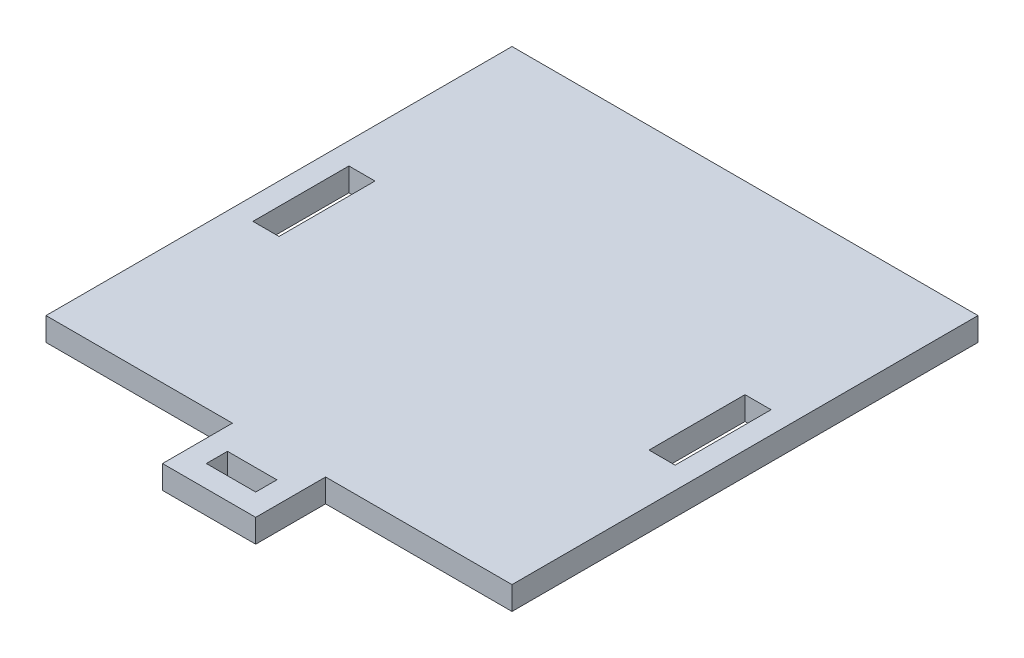
ISO-10303-21;
HEADER;
FILE_DESCRIPTION(('STEP AP214'),'2;1');
FILE_NAME('part.step','',(''),(''),'','','');
FILE_SCHEMA(('AUTOMOTIVE_DESIGN { 1 0 10303 214 1 1 1 1 }'));
ENDSEC;
DATA;
#1=APPLICATION_CONTEXT('core data for automotive mechanical design processes');
#2=APPLICATION_PROTOCOL_DEFINITION('international standard','automotive_design',2000,#1);
#3=PRODUCT_CONTEXT('',#1,'mechanical');
#4=PRODUCT('Part','Part','',(#3));
#5=PRODUCT_RELATED_PRODUCT_CATEGORY('part','',(#4));
#6=PRODUCT_DEFINITION_FORMATION('','',#4);
#7=PRODUCT_DEFINITION_CONTEXT('part definition',#1,'design');
#8=PRODUCT_DEFINITION('design','',#6,#7);
#9=PRODUCT_DEFINITION_SHAPE('','',#8);
#10=(LENGTH_UNIT() NAMED_UNIT(*) SI_UNIT(.MILLI.,.METRE.));
#11=(NAMED_UNIT(*) PLANE_ANGLE_UNIT() SI_UNIT($,.RADIAN.));
#12=(NAMED_UNIT(*) SI_UNIT($,.STERADIAN.) SOLID_ANGLE_UNIT());
#13=UNCERTAINTY_MEASURE_WITH_UNIT(LENGTH_MEASURE(1.E-05),#10,'distance_accuracy_value','');
#14=(GEOMETRIC_REPRESENTATION_CONTEXT(3) GLOBAL_UNCERTAINTY_ASSIGNED_CONTEXT((#13)) GLOBAL_UNIT_ASSIGNED_CONTEXT((#10,
#11,#12)) REPRESENTATION_CONTEXT('',''));
#15=CARTESIAN_POINT('',(0.,0.,0.));
#16=DIRECTION('',(0.,0.,1.));
#17=DIRECTION('',(1.,0.,0.));
#18=AXIS2_PLACEMENT_3D('',#15,#16,#17);
#19=CARTESIAN_POINT('',(0.,5.,0.));
#20=DIRECTION('',(0.,1.,0.));
#21=DIRECTION('',(0.,0.,1.));
#22=AXIS2_PLACEMENT_3D('',#19,#20,#21);
#23=PLANE('',#22);
#24=DIRECTION('',(0.,0.,1.));
#25=VECTOR('',#24,1.);
#26=CARTESIAN_POINT('',(0.,5.,0.));
#27=LINE('',#26,#25);
#28=CARTESIAN_POINT('',(0.,5.,0.));
#29=VERTEX_POINT('',#28);
#30=CARTESIAN_POINT('',(0.,5.,100.));
#31=VERTEX_POINT('',#30);
#32=EDGE_CURVE('E270',#29,#31,#27,.T.);
#33=ORIENTED_EDGE('',*,*,#32,.T.);
#34=DIRECTION('',(1.,0.,0.));
#35=VECTOR('',#34,1.);
#36=CARTESIAN_POINT('',(0.,5.,100.));
#37=LINE('',#36,#35);
#38=CARTESIAN_POINT('',(40.,5.,100.));
#39=VERTEX_POINT('',#38);
#40=EDGE_CURVE('E273',#31,#39,#37,.T.);
#41=ORIENTED_EDGE('',*,*,#40,.T.);
#42=DIRECTION('',(0.,0.,1.));
#43=VECTOR('',#42,1.);
#44=CARTESIAN_POINT('',(40.,5.,100.));
#45=LINE('',#44,#43);
#46=CARTESIAN_POINT('',(40.,5.,115.));
#47=VERTEX_POINT('',#46);
#48=EDGE_CURVE('E276',#39,#47,#45,.T.);
#49=ORIENTED_EDGE('',*,*,#48,.T.);
#50=DIRECTION('',(1.,0.,0.));
#51=VECTOR('',#50,1.);
#52=CARTESIAN_POINT('',(40.,5.,115.));
#53=LINE('',#52,#51);
#54=CARTESIAN_POINT('',(60.,5.,115.));
#55=VERTEX_POINT('',#54);
#56=EDGE_CURVE('E278',#47,#55,#53,.T.);
#57=ORIENTED_EDGE('',*,*,#56,.T.);
#58=DIRECTION('',(0.,0.,-1.));
#59=VECTOR('',#58,1.);
#60=CARTESIAN_POINT('',(60.,5.,100.));
#61=LINE('',#60,#59);
#62=CARTESIAN_POINT('',(60.,5.,100.));
#63=VERTEX_POINT('',#62);
#64=EDGE_CURVE('E280',#55,#63,#61,.T.);
#65=ORIENTED_EDGE('',*,*,#64,.T.);
#66=DIRECTION('',(1.,0.,0.));
#67=VECTOR('',#66,1.);
#68=CARTESIAN_POINT('',(60.,5.,100.));
#69=LINE('',#68,#67);
#70=CARTESIAN_POINT('',(100.,5.,100.));
#71=VERTEX_POINT('',#70);
#72=EDGE_CURVE('E282',#63,#71,#69,.T.);
#73=ORIENTED_EDGE('',*,*,#72,.T.);
#74=DIRECTION('',(0.,0.,-1.));
#75=VECTOR('',#74,1.);
#76=CARTESIAN_POINT('',(100.,5.,0.));
#77=LINE('',#76,#75);
#78=CARTESIAN_POINT('',(100.,5.,0.));
#79=VERTEX_POINT('',#78);
#80=EDGE_CURVE('E284',#71,#79,#77,.T.);
#81=ORIENTED_EDGE('',*,*,#80,.T.);
#82=DIRECTION('',(-1.,0.,0.));
#83=VECTOR('',#82,1.);
#84=CARTESIAN_POINT('',(0.,5.,0.));
#85=LINE('',#84,#83);
#86=EDGE_CURVE('E286',#79,#29,#85,.T.);
#87=ORIENTED_EDGE('',*,*,#86,.T.);
#88=EDGE_LOOP('',(#33,#41,#49,#57,#65,#73,#81,#87));
#89=FACE_BOUND('',#88,.T.);
#90=DIRECTION('',(0.,0.,1.));
#91=VECTOR('',#90,1.);
#92=CARTESIAN_POINT('',(4.70000000000001,5.,39.7));
#93=LINE('',#92,#91);
#94=CARTESIAN_POINT('',(4.70000000000001,5.,39.7));
#95=VERTEX_POINT('',#94);
#96=CARTESIAN_POINT('',(4.70000000000001,5.,60.3));
#97=VERTEX_POINT('',#96);
#98=EDGE_CURVE('E241',#95,#97,#93,.T.);
#99=ORIENTED_EDGE('',*,*,#98,.F.);
#100=DIRECTION('',(-1.,0.,0.));
#101=VECTOR('',#100,1.);
#102=CARTESIAN_POINT('',(4.70000000000001,5.,39.7));
#103=LINE('',#102,#101);
#104=CARTESIAN_POINT('',(10.3,5.,39.7));
#105=VERTEX_POINT('',#104);
#106=EDGE_CURVE('E239',#105,#95,#103,.T.);
#107=ORIENTED_EDGE('',*,*,#106,.F.);
#108=DIRECTION('',(0.,0.,-1.));
#109=VECTOR('',#108,1.);
#110=CARTESIAN_POINT('',(10.3,5.,39.7));
#111=LINE('',#110,#109);
#112=CARTESIAN_POINT('',(10.3,5.,60.3));
#113=VERTEX_POINT('',#112);
#114=EDGE_CURVE('E247',#113,#105,#111,.T.);
#115=ORIENTED_EDGE('',*,*,#114,.F.);
#116=DIRECTION('',(1.,0.,0.));
#117=VECTOR('',#116,1.);
#118=CARTESIAN_POINT('',(4.70000000000001,5.,60.3));
#119=LINE('',#118,#117);
#120=EDGE_CURVE('E244',#97,#113,#119,.T.);
#121=ORIENTED_EDGE('',*,*,#120,.F.);
#122=EDGE_LOOP('',(#99,#107,#115,#121));
#123=FACE_BOUND('',#122,.T.);
#124=DIRECTION('',(-1.,0.,0.));
#125=VECTOR('',#124,1.);
#126=CARTESIAN_POINT('',(95.3,5.,39.7));
#127=LINE('',#126,#125);
#128=CARTESIAN_POINT('',(95.3,5.,39.7));
#129=VERTEX_POINT('',#128);
#130=CARTESIAN_POINT('',(89.7,5.,39.7));
#131=VERTEX_POINT('',#130);
#132=EDGE_CURVE('E210',#129,#131,#127,.T.);
#133=ORIENTED_EDGE('',*,*,#132,.F.);
#134=DIRECTION('',(0.,0.,-1.));
#135=VECTOR('',#134,1.);
#136=CARTESIAN_POINT('',(95.3,5.,39.7));
#137=LINE('',#136,#135);
#138=CARTESIAN_POINT('',(95.3,5.,60.3));
#139=VERTEX_POINT('',#138);
#140=EDGE_CURVE('E208',#139,#129,#137,.T.);
#141=ORIENTED_EDGE('',*,*,#140,.F.);
#142=DIRECTION('',(1.,0.,0.));
#143=VECTOR('',#142,1.);
#144=CARTESIAN_POINT('',(95.3,5.,60.3));
#145=LINE('',#144,#143);
#146=CARTESIAN_POINT('',(89.7,5.,60.3));
#147=VERTEX_POINT('',#146);
#148=EDGE_CURVE('E216',#147,#139,#145,.T.);
#149=ORIENTED_EDGE('',*,*,#148,.F.);
#150=DIRECTION('',(0.,0.,1.));
#151=VECTOR('',#150,1.);
#152=CARTESIAN_POINT('',(89.7,5.,39.7));
#153=LINE('',#152,#151);
#154=EDGE_CURVE('E213',#131,#147,#153,.T.);
#155=ORIENTED_EDGE('',*,*,#154,.F.);
#156=EDGE_LOOP('',(#133,#141,#149,#155));
#157=FACE_BOUND('',#156,.T.);
#158=DIRECTION('',(0.,0.,1.));
#159=VECTOR('',#158,1.);
#160=CARTESIAN_POINT('',(44.7,5.,105.756950442233));
#161=LINE('',#160,#159);
#162=CARTESIAN_POINT('',(44.7,5.,105.756950442233));
#163=VERTEX_POINT('',#162);
#164=CARTESIAN_POINT('',(44.7,5.,110.3));
#165=VERTEX_POINT('',#164);
#166=EDGE_CURVE('E180',#163,#165,#161,.T.);
#167=ORIENTED_EDGE('',*,*,#166,.F.);
#168=DIRECTION('',(-1.,0.,0.));
#169=VECTOR('',#168,1.);
#170=CARTESIAN_POINT('',(44.7,5.,105.756950442233));
#171=LINE('',#170,#169);
#172=CARTESIAN_POINT('',(55.3,5.,105.756950442233));
#173=VERTEX_POINT('',#172);
#174=EDGE_CURVE('E172',#173,#163,#171,.T.);
#175=ORIENTED_EDGE('',*,*,#174,.F.);
#176=DIRECTION('',(0.,0.,-1.));
#177=VECTOR('',#176,1.);
#178=CARTESIAN_POINT('',(55.3,5.,105.756950442233));
#179=LINE('',#178,#177);
#180=CARTESIAN_POINT('',(55.3,5.,110.3));
#181=VERTEX_POINT('',#180);
#182=EDGE_CURVE('E194',#181,#173,#179,.T.);
#183=ORIENTED_EDGE('',*,*,#182,.F.);
#184=DIRECTION('',(1.,0.,0.));
#185=VECTOR('',#184,1.);
#186=CARTESIAN_POINT('',(44.7,5.,110.3));
#187=LINE('',#186,#185);
#188=EDGE_CURVE('E192',#165,#181,#187,.T.);
#189=ORIENTED_EDGE('',*,*,#188,.F.);
#190=EDGE_LOOP('',(#167,#175,#183,#189));
#191=FACE_BOUND('',#190,.T.);
#192=ADVANCED_FACE('F35',(#89,#123,#157,#191),#23,.T.);
#193=CARTESIAN_POINT('',(0.,0.,0.));
#194=DIRECTION('',(0.,1.,0.));
#195=DIRECTION('',(0.,0.,1.));
#196=AXIS2_PLACEMENT_3D('',#193,#194,#195);
#197=PLANE('',#196);
#198=DIRECTION('',(0.,0.,-1.));
#199=VECTOR('',#198,1.);
#200=CARTESIAN_POINT('',(95.3,0.,39.7));
#201=LINE('',#200,#199);
#202=CARTESIAN_POINT('',(95.3,0.,60.3));
#203=VERTEX_POINT('',#202);
#204=CARTESIAN_POINT('',(95.3,0.,39.7));
#205=VERTEX_POINT('',#204);
#206=EDGE_CURVE('E188',#203,#205,#201,.T.);
#207=ORIENTED_EDGE('',*,*,#206,.T.);
#208=DIRECTION('',(-1.,0.,0.));
#209=VECTOR('',#208,1.);
#210=CARTESIAN_POINT('',(95.3,0.,39.7));
#211=LINE('',#210,#209);
#212=CARTESIAN_POINT('',(89.7,0.,39.7));
#213=VERTEX_POINT('',#212);
#214=EDGE_CURVE('E221',#205,#213,#211,.T.);
#215=ORIENTED_EDGE('',*,*,#214,.T.);
#216=DIRECTION('',(0.,0.,1.));
#217=VECTOR('',#216,1.);
#218=CARTESIAN_POINT('',(89.7,0.,39.7));
#219=LINE('',#218,#217);
#220=CARTESIAN_POINT('',(89.7,0.,60.3));
#221=VERTEX_POINT('',#220);
#222=EDGE_CURVE('E224',#213,#221,#219,.T.);
#223=ORIENTED_EDGE('',*,*,#222,.T.);
#224=DIRECTION('',(1.,0.,0.));
#225=VECTOR('',#224,1.);
#226=CARTESIAN_POINT('',(95.3,0.,60.3));
#227=LINE('',#226,#225);
#228=EDGE_CURVE('E211',#221,#203,#227,.T.);
#229=ORIENTED_EDGE('',*,*,#228,.T.);
#230=EDGE_LOOP('',(#207,#215,#223,#229));
#231=FACE_BOUND('',#230,.T.);
#232=DIRECTION('',(0.,0.,1.));
#233=VECTOR('',#232,1.);
#234=CARTESIAN_POINT('',(0.,0.,0.));
#235=LINE('',#234,#233);
#236=CARTESIAN_POINT('',(0.,0.,0.));
#237=VERTEX_POINT('',#236);
#238=CARTESIAN_POINT('',(0.,0.,100.));
#239=VERTEX_POINT('',#238);
#240=EDGE_CURVE('E269',#237,#239,#235,.T.);
#241=ORIENTED_EDGE('',*,*,#240,.F.);
#242=DIRECTION('',(-1.,0.,0.));
#243=VECTOR('',#242,1.);
#244=CARTESIAN_POINT('',(0.,0.,0.));
#245=LINE('',#244,#243);
#246=CARTESIAN_POINT('',(100.,0.,0.));
#247=VERTEX_POINT('',#246);
#248=EDGE_CURVE('E274',#247,#237,#245,.T.);
#249=ORIENTED_EDGE('',*,*,#248,.F.);
#250=DIRECTION('',(0.,0.,-1.));
#251=VECTOR('',#250,1.);
#252=CARTESIAN_POINT('',(100.,0.,0.));
#253=LINE('',#252,#251);
#254=CARTESIAN_POINT('',(100.,0.,100.));
#255=VERTEX_POINT('',#254);
#256=EDGE_CURVE('E301',#255,#247,#253,.T.);
#257=ORIENTED_EDGE('',*,*,#256,.F.);
#258=DIRECTION('',(1.,0.,0.));
#259=VECTOR('',#258,1.);
#260=CARTESIAN_POINT('',(60.,0.,100.));
#261=LINE('',#260,#259);
#262=CARTESIAN_POINT('',(60.,0.,100.));
#263=VERTEX_POINT('',#262);
#264=EDGE_CURVE('E299',#263,#255,#261,.T.);
#265=ORIENTED_EDGE('',*,*,#264,.F.);
#266=DIRECTION('',(0.,0.,-1.));
#267=VECTOR('',#266,1.);
#268=CARTESIAN_POINT('',(60.,0.,100.));
#269=LINE('',#268,#267);
#270=CARTESIAN_POINT('',(60.,0.,115.));
#271=VERTEX_POINT('',#270);
#272=EDGE_CURVE('E297',#271,#263,#269,.T.);
#273=ORIENTED_EDGE('',*,*,#272,.F.);
#274=DIRECTION('',(1.,0.,0.));
#275=VECTOR('',#274,1.);
#276=CARTESIAN_POINT('',(40.,0.,115.));
#277=LINE('',#276,#275);
#278=CARTESIAN_POINT('',(40.,0.,115.));
#279=VERTEX_POINT('',#278);
#280=EDGE_CURVE('E295',#279,#271,#277,.T.);
#281=ORIENTED_EDGE('',*,*,#280,.F.);
#282=DIRECTION('',(0.,0.,1.));
#283=VECTOR('',#282,1.);
#284=CARTESIAN_POINT('',(40.,0.,100.));
#285=LINE('',#284,#283);
#286=CARTESIAN_POINT('',(40.,0.,100.));
#287=VERTEX_POINT('',#286);
#288=EDGE_CURVE('E293',#287,#279,#285,.T.);
#289=ORIENTED_EDGE('',*,*,#288,.F.);
#290=DIRECTION('',(1.,0.,0.));
#291=VECTOR('',#290,1.);
#292=CARTESIAN_POINT('',(0.,0.,100.));
#293=LINE('',#292,#291);
#294=EDGE_CURVE('E291',#239,#287,#293,.T.);
#295=ORIENTED_EDGE('',*,*,#294,.F.);
#296=EDGE_LOOP('',(#241,#249,#257,#265,#273,#281,#289,#295));
#297=FACE_BOUND('',#296,.T.);
#298=DIRECTION('',(-1.,0.,0.));
#299=VECTOR('',#298,1.);
#300=CARTESIAN_POINT('',(4.70000000000001,0.,39.7));
#301=LINE('',#300,#299);
#302=CARTESIAN_POINT('',(10.3,0.,39.7));
#303=VERTEX_POINT('',#302);
#304=CARTESIAN_POINT('',(4.70000000000001,0.,39.7));
#305=VERTEX_POINT('',#304);
#306=EDGE_CURVE('E238',#303,#305,#301,.T.);
#307=ORIENTED_EDGE('',*,*,#306,.T.);
#308=DIRECTION('',(0.,0.,1.));
#309=VECTOR('',#308,1.);
#310=CARTESIAN_POINT('',(4.70000000000001,0.,39.7));
#311=LINE('',#310,#309);
#312=CARTESIAN_POINT('',(4.70000000000001,0.,60.3));
#313=VERTEX_POINT('',#312);
#314=EDGE_CURVE('E252',#305,#313,#311,.T.);
#315=ORIENTED_EDGE('',*,*,#314,.T.);
#316=DIRECTION('',(1.,0.,0.));
#317=VECTOR('',#316,1.);
#318=CARTESIAN_POINT('',(4.70000000000001,0.,60.3));
#319=LINE('',#318,#317);
#320=CARTESIAN_POINT('',(10.3,0.,60.3));
#321=VERTEX_POINT('',#320);
#322=EDGE_CURVE('E255',#313,#321,#319,.T.);
#323=ORIENTED_EDGE('',*,*,#322,.T.);
#324=DIRECTION('',(0.,0.,-1.));
#325=VECTOR('',#324,1.);
#326=CARTESIAN_POINT('',(10.3,0.,39.7));
#327=LINE('',#326,#325);
#328=EDGE_CURVE('E242',#321,#303,#327,.T.);
#329=ORIENTED_EDGE('',*,*,#328,.T.);
#330=EDGE_LOOP('',(#307,#315,#323,#329));
#331=FACE_BOUND('',#330,.T.);
#332=DIRECTION('',(-1.,0.,0.));
#333=VECTOR('',#332,1.);
#334=CARTESIAN_POINT('',(44.7,0.,105.756950442233));
#335=LINE('',#334,#333);
#336=CARTESIAN_POINT('',(55.3,0.,105.756950442233));
#337=VERTEX_POINT('',#336);
#338=CARTESIAN_POINT('',(44.7,0.,105.756950442233));
#339=VERTEX_POINT('',#338);
#340=EDGE_CURVE('E58',#337,#339,#335,.T.);
#341=ORIENTED_EDGE('',*,*,#340,.T.);
#342=DIRECTION('',(0.,0.,1.));
#343=VECTOR('',#342,1.);
#344=CARTESIAN_POINT('',(44.7,0.,105.756950442233));
#345=LINE('',#344,#343);
#346=CARTESIAN_POINT('',(44.7,0.,110.3));
#347=VERTEX_POINT('',#346);
#348=EDGE_CURVE('E187',#339,#347,#345,.T.);
#349=ORIENTED_EDGE('',*,*,#348,.T.);
#350=DIRECTION('',(1.,0.,0.));
#351=VECTOR('',#350,1.);
#352=CARTESIAN_POINT('',(44.7,0.,110.3));
#353=LINE('',#352,#351);
#354=CARTESIAN_POINT('',(55.3,0.,110.3));
#355=VERTEX_POINT('',#354);
#356=EDGE_CURVE('E200',#347,#355,#353,.T.);
#357=ORIENTED_EDGE('',*,*,#356,.T.);
#358=DIRECTION('',(0.,0.,-1.));
#359=VECTOR('',#358,1.);
#360=CARTESIAN_POINT('',(55.3,0.,105.756950442233));
#361=LINE('',#360,#359);
#362=EDGE_CURVE('E181',#355,#337,#361,.T.);
#363=ORIENTED_EDGE('',*,*,#362,.T.);
#364=EDGE_LOOP('',(#341,#349,#357,#363));
#365=FACE_BOUND('',#364,.T.);
#366=ADVANCED_FACE('F331',(#231,#297,#331,#365),#197,.F.);
#367=CARTESIAN_POINT('',(0.,5.,0.));
#368=DIRECTION('',(1.,0.,0.));
#369=DIRECTION('',(0.,0.,-1.));
#370=AXIS2_PLACEMENT_3D('',#367,#368,#369);
#371=PLANE('',#370);
#372=ORIENTED_EDGE('',*,*,#240,.T.);
#373=DIRECTION('',(0.,-1.,0.));
#374=VECTOR('',#373,1.);
#375=CARTESIAN_POINT('',(0.,5.,100.));
#376=LINE('',#375,#374);
#377=EDGE_CURVE('E11',#31,#239,#376,.T.);
#378=ORIENTED_EDGE('',*,*,#377,.F.);
#379=ORIENTED_EDGE('',*,*,#32,.F.);
#380=DIRECTION('',(0.,-1.,0.));
#381=VECTOR('',#380,1.);
#382=CARTESIAN_POINT('',(0.,5.,0.));
#383=LINE('',#382,#381);
#384=EDGE_CURVE('E288',#29,#237,#383,.T.);
#385=ORIENTED_EDGE('',*,*,#384,.T.);
#386=EDGE_LOOP('',(#372,#378,#379,#385));
#387=FACE_BOUND('',#386,.T.);
#388=ADVANCED_FACE('F37',(#387),#371,.F.);
#389=CARTESIAN_POINT('',(0.,5.,100.));
#390=DIRECTION('',(0.,0.,-1.));
#391=DIRECTION('',(-1.,0.,0.));
#392=AXIS2_PLACEMENT_3D('',#389,#390,#391);
#393=PLANE('',#392);
#394=ORIENTED_EDGE('',*,*,#294,.T.);
#395=DIRECTION('',(0.,-1.,0.));
#396=VECTOR('',#395,1.);
#397=CARTESIAN_POINT('',(40.,5.,100.));
#398=LINE('',#397,#396);
#399=EDGE_CURVE('E43',#39,#287,#398,.T.);
#400=ORIENTED_EDGE('',*,*,#399,.F.);
#401=ORIENTED_EDGE('',*,*,#40,.F.);
#402=ORIENTED_EDGE('',*,*,#377,.T.);
#403=EDGE_LOOP('',(#394,#400,#401,#402));
#404=FACE_BOUND('',#403,.T.);
#405=ADVANCED_FACE('F349',(#404),#393,.F.);
#406=CARTESIAN_POINT('',(40.,5.,100.));
#407=DIRECTION('',(1.,0.,0.));
#408=DIRECTION('',(0.,0.,-1.));
#409=AXIS2_PLACEMENT_3D('',#406,#407,#408);
#410=PLANE('',#409);
#411=ORIENTED_EDGE('',*,*,#288,.T.);
#412=DIRECTION('',(0.,-1.,0.));
#413=VECTOR('',#412,1.);
#414=CARTESIAN_POINT('',(40.,5.,115.));
#415=LINE('',#414,#413);
#416=EDGE_CURVE('E318',#47,#279,#415,.T.);
#417=ORIENTED_EDGE('',*,*,#416,.F.);
#418=ORIENTED_EDGE('',*,*,#48,.F.);
#419=ORIENTED_EDGE('',*,*,#399,.T.);
#420=EDGE_LOOP('',(#411,#417,#418,#419));
#421=FACE_BOUND('',#420,.T.);
#422=ADVANCED_FACE('F325',(#421),#410,.F.);
#423=CARTESIAN_POINT('',(40.,5.,115.));
#424=DIRECTION('',(0.,0.,-1.));
#425=DIRECTION('',(-1.,0.,0.));
#426=AXIS2_PLACEMENT_3D('',#423,#424,#425);
#427=PLANE('',#426);
#428=ORIENTED_EDGE('',*,*,#280,.T.);
#429=DIRECTION('',(0.,-1.,0.));
#430=VECTOR('',#429,1.);
#431=CARTESIAN_POINT('',(60.,5.,115.));
#432=LINE('',#431,#430);
#433=EDGE_CURVE('E315',#55,#271,#432,.T.);
#434=ORIENTED_EDGE('',*,*,#433,.F.);
#435=ORIENTED_EDGE('',*,*,#56,.F.);
#436=ORIENTED_EDGE('',*,*,#416,.T.);
#437=EDGE_LOOP('',(#428,#434,#435,#436));
#438=FACE_BOUND('',#437,.T.);
#439=ADVANCED_FACE('F337',(#438),#427,.F.);
#440=CARTESIAN_POINT('',(60.,5.,100.));
#441=DIRECTION('',(-1.,0.,0.));
#442=DIRECTION('',(0.,0.,1.));
#443=AXIS2_PLACEMENT_3D('',#440,#441,#442);
#444=PLANE('',#443);
#445=ORIENTED_EDGE('',*,*,#272,.T.);
#446=DIRECTION('',(0.,-1.,0.));
#447=VECTOR('',#446,1.);
#448=CARTESIAN_POINT('',(60.,5.,100.));
#449=LINE('',#448,#447);
#450=EDGE_CURVE('E312',#63,#263,#449,.T.);
#451=ORIENTED_EDGE('',*,*,#450,.F.);
#452=ORIENTED_EDGE('',*,*,#64,.F.);
#453=ORIENTED_EDGE('',*,*,#433,.T.);
#454=EDGE_LOOP('',(#445,#451,#452,#453));
#455=FACE_BOUND('',#454,.T.);
#456=ADVANCED_FACE('F341',(#455),#444,.F.);
#457=CARTESIAN_POINT('',(60.,5.,100.));
#458=DIRECTION('',(0.,0.,-1.));
#459=DIRECTION('',(-1.,0.,0.));
#460=AXIS2_PLACEMENT_3D('',#457,#458,#459);
#461=PLANE('',#460);
#462=ORIENTED_EDGE('',*,*,#264,.T.);
#463=DIRECTION('',(0.,-1.,0.));
#464=VECTOR('',#463,1.);
#465=CARTESIAN_POINT('',(100.,5.,100.));
#466=LINE('',#465,#464);
#467=EDGE_CURVE('E309',#71,#255,#466,.T.);
#468=ORIENTED_EDGE('',*,*,#467,.F.);
#469=ORIENTED_EDGE('',*,*,#72,.F.);
#470=ORIENTED_EDGE('',*,*,#450,.T.);
#471=EDGE_LOOP('',(#462,#468,#469,#470));
#472=FACE_BOUND('',#471,.T.);
#473=ADVANCED_FACE('F362',(#472),#461,.F.);
#474=CARTESIAN_POINT('',(100.,5.,0.));
#475=DIRECTION('',(-1.,0.,0.));
#476=DIRECTION('',(0.,0.,1.));
#477=AXIS2_PLACEMENT_3D('',#474,#475,#476);
#478=PLANE('',#477);
#479=ORIENTED_EDGE('',*,*,#256,.T.);
#480=DIRECTION('',(0.,-1.,0.));
#481=VECTOR('',#480,1.);
#482=CARTESIAN_POINT('',(100.,5.,0.));
#483=LINE('',#482,#481);
#484=EDGE_CURVE('E306',#79,#247,#483,.T.);
#485=ORIENTED_EDGE('',*,*,#484,.F.);
#486=ORIENTED_EDGE('',*,*,#80,.F.);
#487=ORIENTED_EDGE('',*,*,#467,.T.);
#488=EDGE_LOOP('',(#479,#485,#486,#487));
#489=FACE_BOUND('',#488,.T.);
#490=ADVANCED_FACE('F360',(#489),#478,.F.);
#491=CARTESIAN_POINT('',(0.,5.,0.));
#492=DIRECTION('',(0.,0.,1.));
#493=DIRECTION('',(1.,0.,0.));
#494=AXIS2_PLACEMENT_3D('',#491,#492,#493);
#495=PLANE('',#494);
#496=ORIENTED_EDGE('',*,*,#248,.T.);
#497=ORIENTED_EDGE('',*,*,#384,.F.);
#498=ORIENTED_EDGE('',*,*,#86,.F.);
#499=ORIENTED_EDGE('',*,*,#484,.T.);
#500=EDGE_LOOP('',(#496,#497,#498,#499));
#501=FACE_BOUND('',#500,.T.);
#502=ADVANCED_FACE('F355',(#501),#495,.F.);
#503=CARTESIAN_POINT('',(4.70000000000001,5.,39.7));
#504=DIRECTION('',(0.,0.,1.));
#505=DIRECTION('',(1.,0.,0.));
#506=AXIS2_PLACEMENT_3D('',#503,#504,#505);
#507=PLANE('',#506);
#508=ORIENTED_EDGE('',*,*,#306,.F.);
#509=DIRECTION('',(0.,-1.,0.));
#510=VECTOR('',#509,1.);
#511=CARTESIAN_POINT('',(10.3,5.,39.7));
#512=LINE('',#511,#510);
#513=EDGE_CURVE('E249',#105,#303,#512,.T.);
#514=ORIENTED_EDGE('',*,*,#513,.F.);
#515=ORIENTED_EDGE('',*,*,#106,.T.);
#516=DIRECTION('',(0.,-1.,0.));
#517=VECTOR('',#516,1.);
#518=CARTESIAN_POINT('',(4.70000000000001,5.,39.7));
#519=LINE('',#518,#517);
#520=EDGE_CURVE('E266',#95,#305,#519,.T.);
#521=ORIENTED_EDGE('',*,*,#520,.T.);
#522=EDGE_LOOP('',(#508,#514,#515,#521));
#523=FACE_BOUND('',#522,.T.);
#524=ADVANCED_FACE('F379',(#523),#507,.T.);
#525=CARTESIAN_POINT('',(4.70000000000001,5.,39.7));
#526=DIRECTION('',(1.,0.,0.));
#527=DIRECTION('',(0.,0.,-1.));
#528=AXIS2_PLACEMENT_3D('',#525,#526,#527);
#529=PLANE('',#528);
#530=ORIENTED_EDGE('',*,*,#314,.F.);
#531=ORIENTED_EDGE('',*,*,#520,.F.);
#532=ORIENTED_EDGE('',*,*,#98,.T.);
#533=DIRECTION('',(0.,-1.,0.));
#534=VECTOR('',#533,1.);
#535=CARTESIAN_POINT('',(4.70000000000001,5.,60.3));
#536=LINE('',#535,#534);
#537=EDGE_CURVE('E264',#97,#313,#536,.T.);
#538=ORIENTED_EDGE('',*,*,#537,.T.);
#539=EDGE_LOOP('',(#530,#531,#532,#538));
#540=FACE_BOUND('',#539,.T.);
#541=ADVANCED_FACE('F386',(#540),#529,.T.);
#542=CARTESIAN_POINT('',(4.70000000000001,5.,60.3));
#543=DIRECTION('',(0.,0.,-1.));
#544=DIRECTION('',(-1.,0.,0.));
#545=AXIS2_PLACEMENT_3D('',#542,#543,#544);
#546=PLANE('',#545);
#547=ORIENTED_EDGE('',*,*,#322,.F.);
#548=ORIENTED_EDGE('',*,*,#537,.F.);
#549=ORIENTED_EDGE('',*,*,#120,.T.);
#550=DIRECTION('',(0.,-1.,0.));
#551=VECTOR('',#550,1.);
#552=CARTESIAN_POINT('',(10.3,5.,60.3));
#553=LINE('',#552,#551);
#554=EDGE_CURVE('E262',#113,#321,#553,.T.);
#555=ORIENTED_EDGE('',*,*,#554,.T.);
#556=EDGE_LOOP('',(#547,#548,#549,#555));
#557=FACE_BOUND('',#556,.T.);
#558=ADVANCED_FACE('F391',(#557),#546,.T.);
#559=CARTESIAN_POINT('',(10.3,5.,39.7));
#560=DIRECTION('',(-1.,0.,0.));
#561=DIRECTION('',(0.,0.,1.));
#562=AXIS2_PLACEMENT_3D('',#559,#560,#561);
#563=PLANE('',#562);
#564=ORIENTED_EDGE('',*,*,#328,.F.);
#565=ORIENTED_EDGE('',*,*,#554,.F.);
#566=ORIENTED_EDGE('',*,*,#114,.T.);
#567=ORIENTED_EDGE('',*,*,#513,.T.);
#568=EDGE_LOOP('',(#564,#565,#566,#567));
#569=FACE_BOUND('',#568,.T.);
#570=ADVANCED_FACE('F398',(#569),#563,.T.);
#571=CARTESIAN_POINT('',(95.3,5.,39.7));
#572=DIRECTION('',(-1.,0.,0.));
#573=DIRECTION('',(0.,0.,1.));
#574=AXIS2_PLACEMENT_3D('',#571,#572,#573);
#575=PLANE('',#574);
#576=ORIENTED_EDGE('',*,*,#206,.F.);
#577=DIRECTION('',(0.,-1.,0.));
#578=VECTOR('',#577,1.);
#579=CARTESIAN_POINT('',(95.3,5.,60.3));
#580=LINE('',#579,#578);
#581=EDGE_CURVE('E218',#139,#203,#580,.T.);
#582=ORIENTED_EDGE('',*,*,#581,.F.);
#583=ORIENTED_EDGE('',*,*,#140,.T.);
#584=DIRECTION('',(0.,-1.,0.));
#585=VECTOR('',#584,1.);
#586=CARTESIAN_POINT('',(95.3,5.,39.7));
#587=LINE('',#586,#585);
#588=EDGE_CURVE('E235',#129,#205,#587,.T.);
#589=ORIENTED_EDGE('',*,*,#588,.T.);
#590=EDGE_LOOP('',(#576,#582,#583,#589));
#591=FACE_BOUND('',#590,.T.);
#592=ADVANCED_FACE('F420',(#591),#575,.T.);
#593=CARTESIAN_POINT('',(95.3,5.,39.7));
#594=DIRECTION('',(0.,0.,1.));
#595=DIRECTION('',(1.,0.,0.));
#596=AXIS2_PLACEMENT_3D('',#593,#594,#595);
#597=PLANE('',#596);
#598=ORIENTED_EDGE('',*,*,#214,.F.);
#599=ORIENTED_EDGE('',*,*,#588,.F.);
#600=ORIENTED_EDGE('',*,*,#132,.T.);
#601=DIRECTION('',(0.,-1.,0.));
#602=VECTOR('',#601,1.);
#603=CARTESIAN_POINT('',(89.7,5.,39.7));
#604=LINE('',#603,#602);
#605=EDGE_CURVE('E233',#131,#213,#604,.T.);
#606=ORIENTED_EDGE('',*,*,#605,.T.);
#607=EDGE_LOOP('',(#598,#599,#600,#606));
#608=FACE_BOUND('',#607,.T.);
#609=ADVANCED_FACE('F414',(#608),#597,.T.);
#610=CARTESIAN_POINT('',(89.7,5.,39.7));
#611=DIRECTION('',(1.,0.,0.));
#612=DIRECTION('',(0.,0.,-1.));
#613=AXIS2_PLACEMENT_3D('',#610,#611,#612);
#614=PLANE('',#613);
#615=ORIENTED_EDGE('',*,*,#222,.F.);
#616=ORIENTED_EDGE('',*,*,#605,.F.);
#617=ORIENTED_EDGE('',*,*,#154,.T.);
#618=DIRECTION('',(0.,-1.,0.));
#619=VECTOR('',#618,1.);
#620=CARTESIAN_POINT('',(89.7,5.,60.3));
#621=LINE('',#620,#619);
#622=EDGE_CURVE('E231',#147,#221,#621,.T.);
#623=ORIENTED_EDGE('',*,*,#622,.T.);
#624=EDGE_LOOP('',(#615,#616,#617,#623));
#625=FACE_BOUND('',#624,.T.);
#626=ADVANCED_FACE('F417',(#625),#614,.T.);
#627=CARTESIAN_POINT('',(95.3,5.,60.3));
#628=DIRECTION('',(0.,0.,-1.));
#629=DIRECTION('',(-1.,0.,0.));
#630=AXIS2_PLACEMENT_3D('',#627,#628,#629);
#631=PLANE('',#630);
#632=ORIENTED_EDGE('',*,*,#228,.F.);
#633=ORIENTED_EDGE('',*,*,#622,.F.);
#634=ORIENTED_EDGE('',*,*,#148,.T.);
#635=ORIENTED_EDGE('',*,*,#581,.T.);
#636=EDGE_LOOP('',(#632,#633,#634,#635));
#637=FACE_BOUND('',#636,.T.);
#638=ADVANCED_FACE('F423',(#637),#631,.T.);
#639=CARTESIAN_POINT('',(44.7,5.,105.756950442233));
#640=DIRECTION('',(0.,0.,1.));
#641=DIRECTION('',(1.,0.,0.));
#642=AXIS2_PLACEMENT_3D('',#639,#640,#641);
#643=PLANE('',#642);
#644=ORIENTED_EDGE('',*,*,#340,.F.);
#645=DIRECTION('',(0.,-1.,0.));
#646=VECTOR('',#645,1.);
#647=CARTESIAN_POINT('',(55.3,5.,105.756950442233));
#648=LINE('',#647,#646);
#649=EDGE_CURVE('E176',#173,#337,#648,.T.);
#650=ORIENTED_EDGE('',*,*,#649,.F.);
#651=ORIENTED_EDGE('',*,*,#174,.T.);
#652=DIRECTION('',(0.,-1.,0.));
#653=VECTOR('',#652,1.);
#654=CARTESIAN_POINT('',(44.7,5.,105.756950442233));
#655=LINE('',#654,#653);
#656=EDGE_CURVE('E175',#163,#339,#655,.T.);
#657=ORIENTED_EDGE('',*,*,#656,.T.);
#658=EDGE_LOOP('',(#644,#650,#651,#657));
#659=FACE_BOUND('',#658,.T.);
#660=ADVANCED_FACE('F174',(#659),#643,.T.);
#661=CARTESIAN_POINT('',(44.7,5.,105.756950442233));
#662=DIRECTION('',(1.,0.,0.));
#663=DIRECTION('',(0.,0.,-1.));
#664=AXIS2_PLACEMENT_3D('',#661,#662,#663);
#665=PLANE('',#664);
#666=ORIENTED_EDGE('',*,*,#348,.F.);
#667=ORIENTED_EDGE('',*,*,#656,.F.);
#668=ORIENTED_EDGE('',*,*,#166,.T.);
#669=DIRECTION('',(0.,-1.,0.));
#670=VECTOR('',#669,1.);
#671=CARTESIAN_POINT('',(44.7,5.,110.3));
#672=LINE('',#671,#670);
#673=EDGE_CURVE('E189',#165,#347,#672,.T.);
#674=ORIENTED_EDGE('',*,*,#673,.T.);
#675=EDGE_LOOP('',(#666,#667,#668,#674));
#676=FACE_BOUND('',#675,.T.);
#677=ADVANCED_FACE('F184',(#676),#665,.T.);
#678=CARTESIAN_POINT('',(44.7,5.,110.3));
#679=DIRECTION('',(0.,0.,-1.));
#680=DIRECTION('',(-1.,0.,0.));
#681=AXIS2_PLACEMENT_3D('',#678,#679,#680);
#682=PLANE('',#681);
#683=ORIENTED_EDGE('',*,*,#356,.F.);
#684=ORIENTED_EDGE('',*,*,#673,.F.);
#685=ORIENTED_EDGE('',*,*,#188,.T.);
#686=DIRECTION('',(0.,-1.,0.));
#687=VECTOR('',#686,1.);
#688=CARTESIAN_POINT('',(55.3,5.,110.3));
#689=LINE('',#688,#687);
#690=EDGE_CURVE('E50',#181,#355,#689,.T.);
#691=ORIENTED_EDGE('',*,*,#690,.T.);
#692=EDGE_LOOP('',(#683,#684,#685,#691));
#693=FACE_BOUND('',#692,.T.);
#694=ADVANCED_FACE('F480',(#693),#682,.T.);
#695=CARTESIAN_POINT('',(55.3,5.,105.756950442233));
#696=DIRECTION('',(-1.,0.,0.));
#697=DIRECTION('',(0.,0.,1.));
#698=AXIS2_PLACEMENT_3D('',#695,#696,#697);
#699=PLANE('',#698);
#700=ORIENTED_EDGE('',*,*,#362,.F.);
#701=ORIENTED_EDGE('',*,*,#690,.F.);
#702=ORIENTED_EDGE('',*,*,#182,.T.);
#703=ORIENTED_EDGE('',*,*,#649,.T.);
#704=EDGE_LOOP('',(#700,#701,#702,#703));
#705=FACE_BOUND('',#704,.T.);
#706=ADVANCED_FACE('F488',(#705),#699,.T.);
#707=CLOSED_SHELL('',(#192,#366,#388,#405,#422,#439,#456,#473,#490,#502,#524,#541,#558,#570,
#592,#609,#626,#638,#660,#677,#694,#706));
#708=MANIFOLD_SOLID_BREP('B2',#707);
#709=ADVANCED_BREP_SHAPE_REPRESENTATION('',(#18,#708),#14);
#710=SHAPE_DEFINITION_REPRESENTATION(#9,#709);
ENDSEC;
END-ISO-10303-21;
